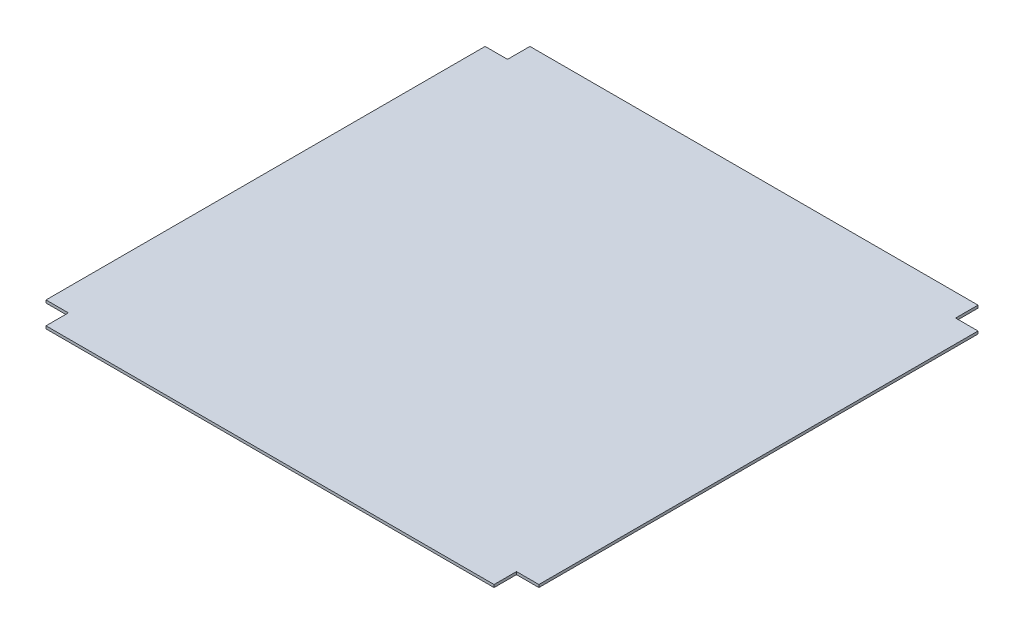
ISO-10303-21;
HEADER;
FILE_DESCRIPTION(('STEP AP214'),'2;1');
FILE_NAME('part.step','',(''),(''),'','','');
FILE_SCHEMA(('AUTOMOTIVE_DESIGN { 1 0 10303 214 1 1 1 1 }'));
ENDSEC;
DATA;
#1=APPLICATION_CONTEXT('core data for automotive mechanical design processes');
#2=APPLICATION_PROTOCOL_DEFINITION('international standard','automotive_design',2000,#1);
#3=PRODUCT_CONTEXT('',#1,'mechanical');
#4=PRODUCT('Part','Part','',(#3));
#5=PRODUCT_RELATED_PRODUCT_CATEGORY('part','',(#4));
#6=PRODUCT_DEFINITION_FORMATION('','',#4);
#7=PRODUCT_DEFINITION_CONTEXT('part definition',#1,'design');
#8=PRODUCT_DEFINITION('design','',#6,#7);
#9=PRODUCT_DEFINITION_SHAPE('','',#8);
#10=(LENGTH_UNIT() NAMED_UNIT(*) SI_UNIT(.MILLI.,.METRE.));
#11=(NAMED_UNIT(*) PLANE_ANGLE_UNIT() SI_UNIT($,.RADIAN.));
#12=(NAMED_UNIT(*) SI_UNIT($,.STERADIAN.) SOLID_ANGLE_UNIT());
#13=UNCERTAINTY_MEASURE_WITH_UNIT(LENGTH_MEASURE(1.E-05),#10,'distance_accuracy_value','');
#14=(GEOMETRIC_REPRESENTATION_CONTEXT(3) GLOBAL_UNCERTAINTY_ASSIGNED_CONTEXT((#13)) GLOBAL_UNIT_ASSIGNED_CONTEXT((#10,
#11,#12)) REPRESENTATION_CONTEXT('',''));
#15=CARTESIAN_POINT('',(0.,0.,0.));
#16=DIRECTION('',(0.,0.,1.));
#17=DIRECTION('',(1.,0.,0.));
#18=AXIS2_PLACEMENT_3D('',#15,#16,#17);
#19=CARTESIAN_POINT('',(250.,-3.,-245.));
#20=DIRECTION('',(0.,0.,-1.));
#21=DIRECTION('',(-1.,0.,0.));
#22=AXIS2_PLACEMENT_3D('',#19,#20,#21);
#23=PLANE('',#22);
#24=DIRECTION('',(-1.,0.,0.));
#25=VECTOR('',#24,1.);
#26=CARTESIAN_POINT('',(250.,0.,-245.));
#27=LINE('',#26,#25);
#28=CARTESIAN_POINT('',(275.,0.,-245.));
#29=VERTEX_POINT('',#28);
#30=CARTESIAN_POINT('',(250.,0.,-245.));
#31=VERTEX_POINT('',#30);
#32=EDGE_CURVE('E160',#29,#31,#27,.T.);
#33=ORIENTED_EDGE('',*,*,#32,.F.);
#34=DIRECTION('',(0.,1.,0.));
#35=VECTOR('',#34,1.);
#36=CARTESIAN_POINT('',(275.,-3.,-245.));
#37=LINE('',#36,#35);
#38=CARTESIAN_POINT('',(275.,-3.,-245.));
#39=VERTEX_POINT('',#38);
#40=EDGE_CURVE('E11',#39,#29,#37,.T.);
#41=ORIENTED_EDGE('',*,*,#40,.F.);
#42=DIRECTION('',(-1.,0.,0.));
#43=VECTOR('',#42,1.);
#44=CARTESIAN_POINT('',(250.,-3.,-245.));
#45=LINE('',#44,#43);
#46=CARTESIAN_POINT('',(250.,-3.,-245.));
#47=VERTEX_POINT('',#46);
#48=EDGE_CURVE('E192',#39,#47,#45,.T.);
#49=ORIENTED_EDGE('',*,*,#48,.T.);
#50=DIRECTION('',(0.,1.,0.));
#51=VECTOR('',#50,1.);
#52=CARTESIAN_POINT('',(250.,-3.,-245.));
#53=LINE('',#52,#51);
#54=EDGE_CURVE('E42',#47,#31,#53,.T.);
#55=ORIENTED_EDGE('',*,*,#54,.T.);
#56=EDGE_LOOP('',(#33,#41,#49,#55));
#57=FACE_BOUND('',#56,.T.);
#58=ADVANCED_FACE('F39',(#57),#23,.T.);
#59=CARTESIAN_POINT('',(275.,-3.,-245.));
#60=DIRECTION('',(1.,0.,0.));
#61=DIRECTION('',(0.,0.,-1.));
#62=AXIS2_PLACEMENT_3D('',#59,#60,#61);
#63=PLANE('',#62);
#64=DIRECTION('',(0.,0.,-1.));
#65=VECTOR('',#64,1.);
#66=CARTESIAN_POINT('',(275.,0.,-245.));
#67=LINE('',#66,#65);
#68=CARTESIAN_POINT('',(275.,0.,245.));
#69=VERTEX_POINT('',#68);
#70=EDGE_CURVE('E190',#69,#29,#67,.T.);
#71=ORIENTED_EDGE('',*,*,#70,.F.);
#72=DIRECTION('',(0.,1.,0.));
#73=VECTOR('',#72,1.);
#74=CARTESIAN_POINT('',(275.,-3.,245.));
#75=LINE('',#74,#73);
#76=CARTESIAN_POINT('',(275.,-3.,245.));
#77=VERTEX_POINT('',#76);
#78=EDGE_CURVE('E48',#77,#69,#75,.T.);
#79=ORIENTED_EDGE('',*,*,#78,.F.);
#80=DIRECTION('',(0.,0.,-1.));
#81=VECTOR('',#80,1.);
#82=CARTESIAN_POINT('',(275.,-3.,-245.));
#83=LINE('',#82,#81);
#84=EDGE_CURVE('E150',#77,#39,#83,.T.);
#85=ORIENTED_EDGE('',*,*,#84,.T.);
#86=ORIENTED_EDGE('',*,*,#40,.T.);
#87=EDGE_LOOP('',(#71,#79,#85,#86));
#88=FACE_BOUND('',#87,.T.);
#89=ADVANCED_FACE('F212',(#88),#63,.T.);
#90=CARTESIAN_POINT('',(250.,-3.,245.));
#91=DIRECTION('',(0.,0.,1.));
#92=DIRECTION('',(1.,0.,0.));
#93=AXIS2_PLACEMENT_3D('',#90,#91,#92);
#94=PLANE('',#93);
#95=DIRECTION('',(1.,0.,0.));
#96=VECTOR('',#95,1.);
#97=CARTESIAN_POINT('',(250.,0.,245.));
#98=LINE('',#97,#96);
#99=CARTESIAN_POINT('',(250.,0.,245.));
#100=VERTEX_POINT('',#99);
#101=EDGE_CURVE('E137',#100,#69,#98,.T.);
#102=ORIENTED_EDGE('',*,*,#101,.F.);
#103=DIRECTION('',(0.,1.,0.));
#104=VECTOR('',#103,1.);
#105=CARTESIAN_POINT('',(250.,-3.,245.));
#106=LINE('',#105,#104);
#107=CARTESIAN_POINT('',(250.,-3.,245.));
#108=VERTEX_POINT('',#107);
#109=EDGE_CURVE('E132',#108,#100,#106,.T.);
#110=ORIENTED_EDGE('',*,*,#109,.F.);
#111=DIRECTION('',(1.,0.,0.));
#112=VECTOR('',#111,1.);
#113=CARTESIAN_POINT('',(250.,-3.,245.));
#114=LINE('',#113,#112);
#115=EDGE_CURVE('E135',#108,#77,#114,.T.);
#116=ORIENTED_EDGE('',*,*,#115,.T.);
#117=ORIENTED_EDGE('',*,*,#78,.T.);
#118=EDGE_LOOP('',(#102,#110,#116,#117));
#119=FACE_BOUND('',#118,.T.);
#120=ADVANCED_FACE('F134',(#119),#94,.T.);
#121=CARTESIAN_POINT('',(250.,-3.,270.));
#122=DIRECTION('',(1.,0.,0.));
#123=DIRECTION('',(0.,0.,-1.));
#124=AXIS2_PLACEMENT_3D('',#121,#122,#123);
#125=PLANE('',#124);
#126=DIRECTION('',(0.,0.,-1.));
#127=VECTOR('',#126,1.);
#128=CARTESIAN_POINT('',(250.,0.,270.));
#129=LINE('',#128,#127);
#130=CARTESIAN_POINT('',(250.,0.,270.));
#131=VERTEX_POINT('',#130);
#132=EDGE_CURVE('E187',#131,#100,#129,.T.);
#133=ORIENTED_EDGE('',*,*,#132,.F.);
#134=DIRECTION('',(0.,1.,0.));
#135=VECTOR('',#134,1.);
#136=CARTESIAN_POINT('',(250.,-3.,270.));
#137=LINE('',#136,#135);
#138=CARTESIAN_POINT('',(250.,-3.,270.));
#139=VERTEX_POINT('',#138);
#140=EDGE_CURVE('E142',#139,#131,#137,.T.);
#141=ORIENTED_EDGE('',*,*,#140,.F.);
#142=DIRECTION('',(0.,0.,-1.));
#143=VECTOR('',#142,1.);
#144=CARTESIAN_POINT('',(250.,-3.,270.));
#145=LINE('',#144,#143);
#146=EDGE_CURVE('E148',#139,#108,#145,.T.);
#147=ORIENTED_EDGE('',*,*,#146,.T.);
#148=ORIENTED_EDGE('',*,*,#109,.T.);
#149=EDGE_LOOP('',(#133,#141,#147,#148));
#150=FACE_BOUND('',#149,.T.);
#151=ADVANCED_FACE('F152',(#150),#125,.T.);
#152=CARTESIAN_POINT('',(-250.,-3.,270.));
#153=DIRECTION('',(0.,0.,1.));
#154=DIRECTION('',(1.,0.,0.));
#155=AXIS2_PLACEMENT_3D('',#152,#153,#154);
#156=PLANE('',#155);
#157=DIRECTION('',(1.,0.,0.));
#158=VECTOR('',#157,1.);
#159=CARTESIAN_POINT('',(-250.,0.,270.));
#160=LINE('',#159,#158);
#161=CARTESIAN_POINT('',(-250.,0.,270.));
#162=VERTEX_POINT('',#161);
#163=EDGE_CURVE('E184',#162,#131,#160,.T.);
#164=ORIENTED_EDGE('',*,*,#163,.F.);
#165=DIRECTION('',(0.,1.,0.));
#166=VECTOR('',#165,1.);
#167=CARTESIAN_POINT('',(-250.,-3.,270.));
#168=LINE('',#167,#166);
#169=CARTESIAN_POINT('',(-250.,-3.,270.));
#170=VERTEX_POINT('',#169);
#171=EDGE_CURVE('E196',#170,#162,#168,.T.);
#172=ORIENTED_EDGE('',*,*,#171,.F.);
#173=DIRECTION('',(1.,0.,0.));
#174=VECTOR('',#173,1.);
#175=CARTESIAN_POINT('',(-250.,-3.,270.));
#176=LINE('',#175,#174);
#177=EDGE_CURVE('E153',#170,#139,#176,.T.);
#178=ORIENTED_EDGE('',*,*,#177,.T.);
#179=ORIENTED_EDGE('',*,*,#140,.T.);
#180=EDGE_LOOP('',(#164,#172,#178,#179));
#181=FACE_BOUND('',#180,.T.);
#182=ADVANCED_FACE('F225',(#181),#156,.T.);
#183=CARTESIAN_POINT('',(-250.,-3.,270.));
#184=DIRECTION('',(-1.,0.,0.));
#185=DIRECTION('',(0.,0.,1.));
#186=AXIS2_PLACEMENT_3D('',#183,#184,#185);
#187=PLANE('',#186);
#188=DIRECTION('',(0.,0.,1.));
#189=VECTOR('',#188,1.);
#190=CARTESIAN_POINT('',(-250.,0.,270.));
#191=LINE('',#190,#189);
#192=CARTESIAN_POINT('',(-250.,0.,245.));
#193=VERTEX_POINT('',#192);
#194=EDGE_CURVE('E181',#193,#162,#191,.T.);
#195=ORIENTED_EDGE('',*,*,#194,.F.);
#196=DIRECTION('',(0.,1.,0.));
#197=VECTOR('',#196,1.);
#198=CARTESIAN_POINT('',(-250.,-3.,245.));
#199=LINE('',#198,#197);
#200=CARTESIAN_POINT('',(-250.,-3.,245.));
#201=VERTEX_POINT('',#200);
#202=EDGE_CURVE('E198',#201,#193,#199,.T.);
#203=ORIENTED_EDGE('',*,*,#202,.F.);
#204=DIRECTION('',(0.,0.,1.));
#205=VECTOR('',#204,1.);
#206=CARTESIAN_POINT('',(-250.,-3.,270.));
#207=LINE('',#206,#205);
#208=EDGE_CURVE('E155',#201,#170,#207,.T.);
#209=ORIENTED_EDGE('',*,*,#208,.T.);
#210=ORIENTED_EDGE('',*,*,#171,.T.);
#211=EDGE_LOOP('',(#195,#203,#209,#210));
#212=FACE_BOUND('',#211,.T.);
#213=ADVANCED_FACE('F228',(#212),#187,.T.);
#214=CARTESIAN_POINT('',(-250.,-3.,245.));
#215=DIRECTION('',(0.,0.,1.));
#216=DIRECTION('',(1.,0.,0.));
#217=AXIS2_PLACEMENT_3D('',#214,#215,#216);
#218=PLANE('',#217);
#219=DIRECTION('',(1.,0.,0.));
#220=VECTOR('',#219,1.);
#221=CARTESIAN_POINT('',(-250.,0.,245.));
#222=LINE('',#221,#220);
#223=CARTESIAN_POINT('',(-275.,0.,245.));
#224=VERTEX_POINT('',#223);
#225=EDGE_CURVE('E178',#224,#193,#222,.T.);
#226=ORIENTED_EDGE('',*,*,#225,.F.);
#227=DIRECTION('',(0.,1.,0.));
#228=VECTOR('',#227,1.);
#229=CARTESIAN_POINT('',(-275.,-3.,245.));
#230=LINE('',#229,#228);
#231=CARTESIAN_POINT('',(-275.,-3.,245.));
#232=VERTEX_POINT('',#231);
#233=EDGE_CURVE('E200',#232,#224,#230,.T.);
#234=ORIENTED_EDGE('',*,*,#233,.F.);
#235=DIRECTION('',(1.,0.,0.));
#236=VECTOR('',#235,1.);
#237=CARTESIAN_POINT('',(-250.,-3.,245.));
#238=LINE('',#237,#236);
#239=EDGE_CURVE('E382',#232,#201,#238,.T.);
#240=ORIENTED_EDGE('',*,*,#239,.T.);
#241=ORIENTED_EDGE('',*,*,#202,.T.);
#242=EDGE_LOOP('',(#226,#234,#240,#241));
#243=FACE_BOUND('',#242,.T.);
#244=ADVANCED_FACE('F232',(#243),#218,.T.);
#245=CARTESIAN_POINT('',(-275.,-3.,-245.));
#246=DIRECTION('',(-1.,0.,0.));
#247=DIRECTION('',(0.,0.,1.));
#248=AXIS2_PLACEMENT_3D('',#245,#246,#247);
#249=PLANE('',#248);
#250=DIRECTION('',(0.,0.,1.));
#251=VECTOR('',#250,1.);
#252=CARTESIAN_POINT('',(-275.,0.,-245.));
#253=LINE('',#252,#251);
#254=CARTESIAN_POINT('',(-275.,0.,-245.));
#255=VERTEX_POINT('',#254);
#256=EDGE_CURVE('E175',#255,#224,#253,.T.);
#257=ORIENTED_EDGE('',*,*,#256,.F.);
#258=DIRECTION('',(0.,1.,0.));
#259=VECTOR('',#258,1.);
#260=CARTESIAN_POINT('',(-275.,-3.,-245.));
#261=LINE('',#260,#259);
#262=CARTESIAN_POINT('',(-275.,-3.,-245.));
#263=VERTEX_POINT('',#262);
#264=EDGE_CURVE('E202',#263,#255,#261,.T.);
#265=ORIENTED_EDGE('',*,*,#264,.F.);
#266=DIRECTION('',(0.,0.,1.));
#267=VECTOR('',#266,1.);
#268=CARTESIAN_POINT('',(-275.,-3.,-245.));
#269=LINE('',#268,#267);
#270=EDGE_CURVE('E386',#263,#232,#269,.T.);
#271=ORIENTED_EDGE('',*,*,#270,.T.);
#272=ORIENTED_EDGE('',*,*,#233,.T.);
#273=EDGE_LOOP('',(#257,#265,#271,#272));
#274=FACE_BOUND('',#273,.T.);
#275=ADVANCED_FACE('F236',(#274),#249,.T.);
#276=CARTESIAN_POINT('',(-250.,-3.,-245.));
#277=DIRECTION('',(0.,0.,-1.));
#278=DIRECTION('',(-1.,0.,0.));
#279=AXIS2_PLACEMENT_3D('',#276,#277,#278);
#280=PLANE('',#279);
#281=DIRECTION('',(-1.,0.,0.));
#282=VECTOR('',#281,1.);
#283=CARTESIAN_POINT('',(-250.,0.,-245.));
#284=LINE('',#283,#282);
#285=CARTESIAN_POINT('',(-250.,0.,-245.));
#286=VERTEX_POINT('',#285);
#287=EDGE_CURVE('E172',#286,#255,#284,.T.);
#288=ORIENTED_EDGE('',*,*,#287,.F.);
#289=DIRECTION('',(0.,1.,0.));
#290=VECTOR('',#289,1.);
#291=CARTESIAN_POINT('',(-250.,-3.,-245.));
#292=LINE('',#291,#290);
#293=CARTESIAN_POINT('',(-250.,-3.,-245.));
#294=VERTEX_POINT('',#293);
#295=EDGE_CURVE('E204',#294,#286,#292,.T.);
#296=ORIENTED_EDGE('',*,*,#295,.F.);
#297=DIRECTION('',(-1.,0.,0.));
#298=VECTOR('',#297,1.);
#299=CARTESIAN_POINT('',(-250.,-3.,-245.));
#300=LINE('',#299,#298);
#301=EDGE_CURVE('E375',#294,#263,#300,.T.);
#302=ORIENTED_EDGE('',*,*,#301,.T.);
#303=ORIENTED_EDGE('',*,*,#264,.T.);
#304=EDGE_LOOP('',(#288,#296,#302,#303));
#305=FACE_BOUND('',#304,.T.);
#306=ADVANCED_FACE('F240',(#305),#280,.T.);
#307=CARTESIAN_POINT('',(-250.,-3.,-270.));
#308=DIRECTION('',(-1.,0.,0.));
#309=DIRECTION('',(0.,0.,1.));
#310=AXIS2_PLACEMENT_3D('',#307,#308,#309);
#311=PLANE('',#310);
#312=DIRECTION('',(0.,0.,1.));
#313=VECTOR('',#312,1.);
#314=CARTESIAN_POINT('',(-250.,0.,-270.));
#315=LINE('',#314,#313);
#316=CARTESIAN_POINT('',(-250.,0.,-270.));
#317=VERTEX_POINT('',#316);
#318=EDGE_CURVE('E169',#317,#286,#315,.T.);
#319=ORIENTED_EDGE('',*,*,#318,.F.);
#320=DIRECTION('',(0.,1.,0.));
#321=VECTOR('',#320,1.);
#322=CARTESIAN_POINT('',(-250.,-3.,-270.));
#323=LINE('',#322,#321);
#324=CARTESIAN_POINT('',(-250.,-3.,-270.));
#325=VERTEX_POINT('',#324);
#326=EDGE_CURVE('E206',#325,#317,#323,.T.);
#327=ORIENTED_EDGE('',*,*,#326,.F.);
#328=DIRECTION('',(0.,0.,1.));
#329=VECTOR('',#328,1.);
#330=CARTESIAN_POINT('',(-250.,-3.,-270.));
#331=LINE('',#330,#329);
#332=EDGE_CURVE('E371',#325,#294,#331,.T.);
#333=ORIENTED_EDGE('',*,*,#332,.T.);
#334=ORIENTED_EDGE('',*,*,#295,.T.);
#335=EDGE_LOOP('',(#319,#327,#333,#334));
#336=FACE_BOUND('',#335,.T.);
#337=ADVANCED_FACE('F244',(#336),#311,.T.);
#338=CARTESIAN_POINT('',(-250.,-3.,-270.));
#339=DIRECTION('',(0.,0.,-1.));
#340=DIRECTION('',(-1.,0.,0.));
#341=AXIS2_PLACEMENT_3D('',#338,#339,#340);
#342=PLANE('',#341);
#343=DIRECTION('',(-1.,0.,0.));
#344=VECTOR('',#343,1.);
#345=CARTESIAN_POINT('',(-250.,0.,-270.));
#346=LINE('',#345,#344);
#347=CARTESIAN_POINT('',(250.,0.,-270.));
#348=VERTEX_POINT('',#347);
#349=EDGE_CURVE('E166',#348,#317,#346,.T.);
#350=ORIENTED_EDGE('',*,*,#349,.F.);
#351=DIRECTION('',(0.,1.,0.));
#352=VECTOR('',#351,1.);
#353=CARTESIAN_POINT('',(250.,-3.,-270.));
#354=LINE('',#353,#352);
#355=CARTESIAN_POINT('',(250.,-3.,-270.));
#356=VERTEX_POINT('',#355);
#357=EDGE_CURVE('E207',#356,#348,#354,.T.);
#358=ORIENTED_EDGE('',*,*,#357,.F.);
#359=DIRECTION('',(-1.,0.,0.));
#360=VECTOR('',#359,1.);
#361=CARTESIAN_POINT('',(-250.,-3.,-270.));
#362=LINE('',#361,#360);
#363=EDGE_CURVE('E392',#356,#325,#362,.T.);
#364=ORIENTED_EDGE('',*,*,#363,.T.);
#365=ORIENTED_EDGE('',*,*,#326,.T.);
#366=EDGE_LOOP('',(#350,#358,#364,#365));
#367=FACE_BOUND('',#366,.T.);
#368=ADVANCED_FACE('F248',(#367),#342,.T.);
#369=CARTESIAN_POINT('',(250.,-3.,-270.));
#370=DIRECTION('',(1.,0.,0.));
#371=DIRECTION('',(0.,0.,-1.));
#372=AXIS2_PLACEMENT_3D('',#369,#370,#371);
#373=PLANE('',#372);
#374=DIRECTION('',(0.,0.,-1.));
#375=VECTOR('',#374,1.);
#376=CARTESIAN_POINT('',(250.,0.,-270.));
#377=LINE('',#376,#375);
#378=EDGE_CURVE('E163',#31,#348,#377,.T.);
#379=ORIENTED_EDGE('',*,*,#378,.F.);
#380=ORIENTED_EDGE('',*,*,#54,.F.);
#381=DIRECTION('',(0.,0.,-1.));
#382=VECTOR('',#381,1.);
#383=CARTESIAN_POINT('',(250.,-3.,-270.));
#384=LINE('',#383,#382);
#385=EDGE_CURVE('E394',#47,#356,#384,.T.);
#386=ORIENTED_EDGE('',*,*,#385,.T.);
#387=ORIENTED_EDGE('',*,*,#357,.T.);
#388=EDGE_LOOP('',(#379,#380,#386,#387));
#389=FACE_BOUND('',#388,.T.);
#390=ADVANCED_FACE('F209',(#389),#373,.T.);
#391=CARTESIAN_POINT('',(0.,-3.,0.));
#392=DIRECTION('',(0.,-1.,0.));
#393=DIRECTION('',(0.,0.,-1.));
#394=AXIS2_PLACEMENT_3D('',#391,#392,#393);
#395=PLANE('',#394);
#396=ORIENTED_EDGE('',*,*,#48,.F.);
#397=ORIENTED_EDGE('',*,*,#84,.F.);
#398=ORIENTED_EDGE('',*,*,#115,.F.);
#399=ORIENTED_EDGE('',*,*,#146,.F.);
#400=ORIENTED_EDGE('',*,*,#177,.F.);
#401=ORIENTED_EDGE('',*,*,#208,.F.);
#402=ORIENTED_EDGE('',*,*,#239,.F.);
#403=ORIENTED_EDGE('',*,*,#270,.F.);
#404=ORIENTED_EDGE('',*,*,#301,.F.);
#405=ORIENTED_EDGE('',*,*,#332,.F.);
#406=ORIENTED_EDGE('',*,*,#363,.F.);
#407=ORIENTED_EDGE('',*,*,#385,.F.);
#408=EDGE_LOOP('',(#396,#397,#398,#399,#400,#401,#402,#403,#404,#405,#406,#407));
#409=FACE_BOUND('',#408,.T.);
#410=ADVANCED_FACE('F146',(#409),#395,.T.);
#411=CARTESIAN_POINT('',(0.,0.,0.));
#412=DIRECTION('',(0.,-1.,0.));
#413=DIRECTION('',(0.,0.,-1.));
#414=AXIS2_PLACEMENT_3D('',#411,#412,#413);
#415=PLANE('',#414);
#416=ORIENTED_EDGE('',*,*,#32,.T.);
#417=ORIENTED_EDGE('',*,*,#378,.T.);
#418=ORIENTED_EDGE('',*,*,#349,.T.);
#419=ORIENTED_EDGE('',*,*,#318,.T.);
#420=ORIENTED_EDGE('',*,*,#287,.T.);
#421=ORIENTED_EDGE('',*,*,#256,.T.);
#422=ORIENTED_EDGE('',*,*,#225,.T.);
#423=ORIENTED_EDGE('',*,*,#194,.T.);
#424=ORIENTED_EDGE('',*,*,#163,.T.);
#425=ORIENTED_EDGE('',*,*,#132,.T.);
#426=ORIENTED_EDGE('',*,*,#101,.T.);
#427=ORIENTED_EDGE('',*,*,#70,.T.);
#428=EDGE_LOOP('',(#416,#417,#418,#419,#420,#421,#422,#423,#424,#425,#426,#427));
#429=FACE_BOUND('',#428,.T.);
#430=ADVANCED_FACE('F211',(#429),#415,.F.);
#431=CLOSED_SHELL('',(#58,#89,#120,#151,#182,#213,#244,#275,#306,#337,#368,#390,#410,#430));
#432=MANIFOLD_SOLID_BREP('B2',#431);
#433=ADVANCED_BREP_SHAPE_REPRESENTATION('',(#18,#432),#14);
#434=SHAPE_DEFINITION_REPRESENTATION(#9,#433);
ENDSEC;
END-ISO-10303-21;
